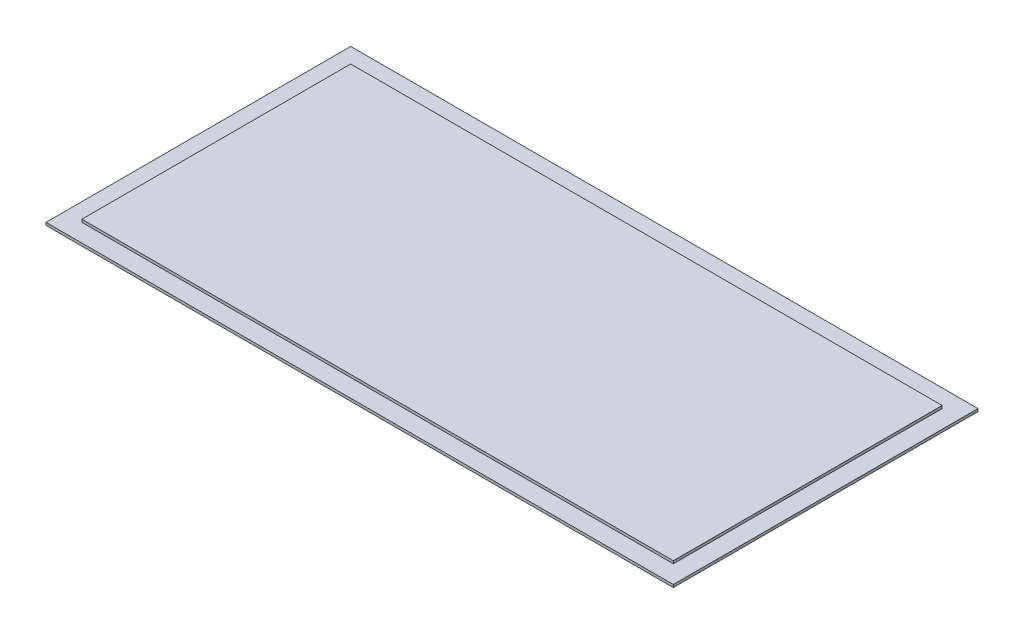
ISO-10303-21;
HEADER;
FILE_DESCRIPTION(('STEP AP214'),'2;1');
FILE_NAME('part.step','',(''),(''),'','','');
FILE_SCHEMA(('AUTOMOTIVE_DESIGN { 1 0 10303 214 1 1 1 1 }'));
ENDSEC;
DATA;
#1=APPLICATION_CONTEXT('core data for automotive mechanical design processes');
#2=APPLICATION_PROTOCOL_DEFINITION('international standard','automotive_design',2000,#1);
#3=PRODUCT_CONTEXT('',#1,'mechanical');
#4=PRODUCT('Part','Part','',(#3));
#5=PRODUCT_RELATED_PRODUCT_CATEGORY('part','',(#4));
#6=PRODUCT_DEFINITION_FORMATION('','',#4);
#7=PRODUCT_DEFINITION_CONTEXT('part definition',#1,'design');
#8=PRODUCT_DEFINITION('design','',#6,#7);
#9=PRODUCT_DEFINITION_SHAPE('','',#8);
#10=(LENGTH_UNIT() NAMED_UNIT(*) SI_UNIT(.MILLI.,.METRE.));
#11=(NAMED_UNIT(*) PLANE_ANGLE_UNIT() SI_UNIT($,.RADIAN.));
#12=(NAMED_UNIT(*) SI_UNIT($,.STERADIAN.) SOLID_ANGLE_UNIT());
#13=UNCERTAINTY_MEASURE_WITH_UNIT(LENGTH_MEASURE(1.E-05),#10,'distance_accuracy_value','');
#14=(GEOMETRIC_REPRESENTATION_CONTEXT(3) GLOBAL_UNCERTAINTY_ASSIGNED_CONTEXT((#13)) GLOBAL_UNIT_ASSIGNED_CONTEXT((#10,
#11,#12)) REPRESENTATION_CONTEXT('',''));
#15=CARTESIAN_POINT('',(0.,0.,0.));
#16=DIRECTION('',(0.,0.,1.));
#17=DIRECTION('',(1.,0.,0.));
#18=AXIS2_PLACEMENT_3D('',#15,#16,#17);
#19=CARTESIAN_POINT('',(0.,3.,0.));
#20=DIRECTION('',(0.,-1.,0.));
#21=DIRECTION('',(0.,0.,-1.));
#22=AXIS2_PLACEMENT_3D('',#19,#20,#21);
#23=PLANE('',#22);
#24=DIRECTION('',(0.,0.,1.));
#25=VECTOR('',#24,1.);
#26=CARTESIAN_POINT('',(-350.,3.,-170.));
#27=LINE('',#26,#25);
#28=CARTESIAN_POINT('',(-350.,3.,-170.));
#29=VERTEX_POINT('',#28);
#30=CARTESIAN_POINT('',(-350.,3.,170.));
#31=VERTEX_POINT('',#30);
#32=EDGE_CURVE('E132',#29,#31,#27,.T.);
#33=ORIENTED_EDGE('',*,*,#32,.T.);
#34=DIRECTION('',(1.,0.,0.));
#35=VECTOR('',#34,1.);
#36=CARTESIAN_POINT('',(350.,3.,170.));
#37=LINE('',#36,#35);
#38=CARTESIAN_POINT('',(350.,3.,170.));
#39=VERTEX_POINT('',#38);
#40=EDGE_CURVE('E135',#31,#39,#37,.T.);
#41=ORIENTED_EDGE('',*,*,#40,.T.);
#42=DIRECTION('',(0.,0.,-1.));
#43=VECTOR('',#42,1.);
#44=CARTESIAN_POINT('',(350.,3.,-170.));
#45=LINE('',#44,#43);
#46=CARTESIAN_POINT('',(350.,3.,-170.));
#47=VERTEX_POINT('',#46);
#48=EDGE_CURVE('E138',#39,#47,#45,.T.);
#49=ORIENTED_EDGE('',*,*,#48,.T.);
#50=DIRECTION('',(-1.,0.,0.));
#51=VECTOR('',#50,1.);
#52=CARTESIAN_POINT('',(350.,3.,-170.));
#53=LINE('',#52,#51);
#54=EDGE_CURVE('E140',#47,#29,#53,.T.);
#55=ORIENTED_EDGE('',*,*,#54,.T.);
#56=EDGE_LOOP('',(#33,#41,#49,#55));
#57=FACE_BOUND('',#56,.T.);
#58=DIRECTION('',(0.,0.,1.));
#59=VECTOR('',#58,1.);
#60=CARTESIAN_POINT('',(-330.,3.,-150.));
#61=LINE('',#60,#59);
#62=CARTESIAN_POINT('',(-330.,3.,-150.));
#63=VERTEX_POINT('',#62);
#64=CARTESIAN_POINT('',(-330.,3.,150.));
#65=VERTEX_POINT('',#64);
#66=EDGE_CURVE('E122',#63,#65,#61,.T.);
#67=ORIENTED_EDGE('',*,*,#66,.F.);
#68=DIRECTION('',(-1.,0.,0.));
#69=VECTOR('',#68,1.);
#70=CARTESIAN_POINT('',(330.,3.,-150.));
#71=LINE('',#70,#69);
#72=CARTESIAN_POINT('',(330.,3.,-150.));
#73=VERTEX_POINT('',#72);
#74=EDGE_CURVE('E119',#73,#63,#71,.T.);
#75=ORIENTED_EDGE('',*,*,#74,.F.);
#76=DIRECTION('',(0.,0.,-1.));
#77=VECTOR('',#76,1.);
#78=CARTESIAN_POINT('',(330.,3.,-150.));
#79=LINE('',#78,#77);
#80=CARTESIAN_POINT('',(330.,3.,150.));
#81=VERTEX_POINT('',#80);
#82=EDGE_CURVE('E57',#81,#73,#79,.T.);
#83=ORIENTED_EDGE('',*,*,#82,.F.);
#84=DIRECTION('',(1.,0.,0.));
#85=VECTOR('',#84,1.);
#86=CARTESIAN_POINT('',(330.,3.,150.));
#87=LINE('',#86,#85);
#88=EDGE_CURVE('E52',#65,#81,#87,.T.);
#89=ORIENTED_EDGE('',*,*,#88,.F.);
#90=EDGE_LOOP('',(#67,#75,#83,#89));
#91=FACE_BOUND('',#90,.T.);
#92=ADVANCED_FACE('F37',(#57,#91),#23,.F.);
#93=CARTESIAN_POINT('',(-350.,3.,-170.));
#94=DIRECTION('',(1.,0.,0.));
#95=DIRECTION('',(0.,0.,-1.));
#96=AXIS2_PLACEMENT_3D('',#93,#94,#95);
#97=PLANE('',#96);
#98=DIRECTION('',(0.,0.,1.));
#99=VECTOR('',#98,1.);
#100=CARTESIAN_POINT('',(-350.,0.,-170.));
#101=LINE('',#100,#99);
#102=CARTESIAN_POINT('',(-350.,0.,-170.));
#103=VERTEX_POINT('',#102);
#104=CARTESIAN_POINT('',(-350.,0.,170.));
#105=VERTEX_POINT('',#104);
#106=EDGE_CURVE('E123',#103,#105,#101,.T.);
#107=ORIENTED_EDGE('',*,*,#106,.T.);
#108=DIRECTION('',(0.,-1.,0.));
#109=VECTOR('',#108,1.);
#110=CARTESIAN_POINT('',(-350.,3.,170.));
#111=LINE('',#110,#109);
#112=EDGE_CURVE('E11',#31,#105,#111,.T.);
#113=ORIENTED_EDGE('',*,*,#112,.F.);
#114=ORIENTED_EDGE('',*,*,#32,.F.);
#115=DIRECTION('',(0.,-1.,0.));
#116=VECTOR('',#115,1.);
#117=CARTESIAN_POINT('',(-350.,3.,-170.));
#118=LINE('',#117,#116);
#119=EDGE_CURVE('E141',#29,#103,#118,.T.);
#120=ORIENTED_EDGE('',*,*,#119,.T.);
#121=EDGE_LOOP('',(#107,#113,#114,#120));
#122=FACE_BOUND('',#121,.T.);
#123=ADVANCED_FACE('F39',(#122),#97,.F.);
#124=CARTESIAN_POINT('',(350.,3.,170.));
#125=DIRECTION('',(0.,0.,-1.));
#126=DIRECTION('',(-1.,0.,0.));
#127=AXIS2_PLACEMENT_3D('',#124,#125,#126);
#128=PLANE('',#127);
#129=DIRECTION('',(1.,0.,0.));
#130=VECTOR('',#129,1.);
#131=CARTESIAN_POINT('',(350.,0.,170.));
#132=LINE('',#131,#130);
#133=CARTESIAN_POINT('',(350.,0.,170.));
#134=VERTEX_POINT('',#133);
#135=EDGE_CURVE('E126',#105,#134,#132,.T.);
#136=ORIENTED_EDGE('',*,*,#135,.T.);
#137=DIRECTION('',(0.,-1.,0.));
#138=VECTOR('',#137,1.);
#139=CARTESIAN_POINT('',(350.,3.,170.));
#140=LINE('',#139,#138);
#141=EDGE_CURVE('E45',#39,#134,#140,.T.);
#142=ORIENTED_EDGE('',*,*,#141,.F.);
#143=ORIENTED_EDGE('',*,*,#40,.F.);
#144=ORIENTED_EDGE('',*,*,#112,.T.);
#145=EDGE_LOOP('',(#136,#142,#143,#144));
#146=FACE_BOUND('',#145,.T.);
#147=ADVANCED_FACE('F171',(#146),#128,.F.);
#148=CARTESIAN_POINT('',(350.,3.,-170.));
#149=DIRECTION('',(-1.,0.,0.));
#150=DIRECTION('',(0.,0.,1.));
#151=AXIS2_PLACEMENT_3D('',#148,#149,#150);
#152=PLANE('',#151);
#153=DIRECTION('',(0.,0.,-1.));
#154=VECTOR('',#153,1.);
#155=CARTESIAN_POINT('',(350.,0.,-170.));
#156=LINE('',#155,#154);
#157=CARTESIAN_POINT('',(350.,0.,-170.));
#158=VERTEX_POINT('',#157);
#159=EDGE_CURVE('E144',#134,#158,#156,.T.);
#160=ORIENTED_EDGE('',*,*,#159,.T.);
#161=DIRECTION('',(0.,-1.,0.));
#162=VECTOR('',#161,1.);
#163=CARTESIAN_POINT('',(350.,3.,-170.));
#164=LINE('',#163,#162);
#165=EDGE_CURVE('E149',#47,#158,#164,.T.);
#166=ORIENTED_EDGE('',*,*,#165,.F.);
#167=ORIENTED_EDGE('',*,*,#48,.F.);
#168=ORIENTED_EDGE('',*,*,#141,.T.);
#169=EDGE_LOOP('',(#160,#166,#167,#168));
#170=FACE_BOUND('',#169,.T.);
#171=ADVANCED_FACE('F156',(#170),#152,.F.);
#172=CARTESIAN_POINT('',(350.,3.,-170.));
#173=DIRECTION('',(0.,0.,1.));
#174=DIRECTION('',(1.,0.,0.));
#175=AXIS2_PLACEMENT_3D('',#172,#173,#174);
#176=PLANE('',#175);
#177=DIRECTION('',(-1.,0.,0.));
#178=VECTOR('',#177,1.);
#179=CARTESIAN_POINT('',(350.,0.,-170.));
#180=LINE('',#179,#178);
#181=EDGE_CURVE('E136',#158,#103,#180,.T.);
#182=ORIENTED_EDGE('',*,*,#181,.T.);
#183=ORIENTED_EDGE('',*,*,#119,.F.);
#184=ORIENTED_EDGE('',*,*,#54,.F.);
#185=ORIENTED_EDGE('',*,*,#165,.T.);
#186=EDGE_LOOP('',(#182,#183,#184,#185));
#187=FACE_BOUND('',#186,.T.);
#188=ADVANCED_FACE('F165',(#187),#176,.F.);
#189=CARTESIAN_POINT('',(0.,0.,0.));
#190=DIRECTION('',(0.,-1.,0.));
#191=DIRECTION('',(0.,0.,-1.));
#192=AXIS2_PLACEMENT_3D('',#189,#190,#191);
#193=PLANE('',#192);
#194=ORIENTED_EDGE('',*,*,#106,.F.);
#195=ORIENTED_EDGE('',*,*,#181,.F.);
#196=ORIENTED_EDGE('',*,*,#159,.F.);
#197=ORIENTED_EDGE('',*,*,#135,.F.);
#198=EDGE_LOOP('',(#194,#195,#196,#197));
#199=FACE_BOUND('',#198,.T.);
#200=ADVANCED_FACE('F162',(#199),#193,.T.);
#201=CARTESIAN_POINT('',(-330.,6.,-150.));
#202=DIRECTION('',(1.,0.,0.));
#203=DIRECTION('',(0.,0.,-1.));
#204=AXIS2_PLACEMENT_3D('',#201,#202,#203);
#205=PLANE('',#204);
#206=ORIENTED_EDGE('',*,*,#66,.T.);
#207=DIRECTION('',(0.,-1.,0.));
#208=VECTOR('',#207,1.);
#209=CARTESIAN_POINT('',(-330.,6.,150.));
#210=LINE('',#209,#208);
#211=CARTESIAN_POINT('',(-330.,6.,150.));
#212=VERTEX_POINT('',#211);
#213=EDGE_CURVE('E103',#212,#65,#210,.T.);
#214=ORIENTED_EDGE('',*,*,#213,.F.);
#215=DIRECTION('',(0.,0.,1.));
#216=VECTOR('',#215,1.);
#217=CARTESIAN_POINT('',(-330.,6.,-150.));
#218=LINE('',#217,#216);
#219=CARTESIAN_POINT('',(-330.,6.,-150.));
#220=VERTEX_POINT('',#219);
#221=EDGE_CURVE('E110',#220,#212,#218,.T.);
#222=ORIENTED_EDGE('',*,*,#221,.F.);
#223=DIRECTION('',(0.,-1.,0.));
#224=VECTOR('',#223,1.);
#225=CARTESIAN_POINT('',(-330.,6.,-150.));
#226=LINE('',#225,#224);
#227=EDGE_CURVE('E266',#220,#63,#226,.T.);
#228=ORIENTED_EDGE('',*,*,#227,.T.);
#229=EDGE_LOOP('',(#206,#214,#222,#228));
#230=FACE_BOUND('',#229,.T.);
#231=ADVANCED_FACE('F121',(#230),#205,.F.);
#232=CARTESIAN_POINT('',(330.,6.,150.));
#233=DIRECTION('',(0.,0.,-1.));
#234=DIRECTION('',(-1.,0.,0.));
#235=AXIS2_PLACEMENT_3D('',#232,#233,#234);
#236=PLANE('',#235);
#237=ORIENTED_EDGE('',*,*,#88,.T.);
#238=DIRECTION('',(0.,-1.,0.));
#239=VECTOR('',#238,1.);
#240=CARTESIAN_POINT('',(330.,6.,150.));
#241=LINE('',#240,#239);
#242=CARTESIAN_POINT('',(330.,6.,150.));
#243=VERTEX_POINT('',#242);
#244=EDGE_CURVE('E106',#243,#81,#241,.T.);
#245=ORIENTED_EDGE('',*,*,#244,.F.);
#246=DIRECTION('',(1.,0.,0.));
#247=VECTOR('',#246,1.);
#248=CARTESIAN_POINT('',(330.,6.,150.));
#249=LINE('',#248,#247);
#250=EDGE_CURVE('E99',#212,#243,#249,.T.);
#251=ORIENTED_EDGE('',*,*,#250,.F.);
#252=ORIENTED_EDGE('',*,*,#213,.T.);
#253=EDGE_LOOP('',(#237,#245,#251,#252));
#254=FACE_BOUND('',#253,.T.);
#255=ADVANCED_FACE('F101',(#254),#236,.F.);
#256=CARTESIAN_POINT('',(330.,6.,-150.));
#257=DIRECTION('',(-1.,0.,0.));
#258=DIRECTION('',(0.,0.,1.));
#259=AXIS2_PLACEMENT_3D('',#256,#257,#258);
#260=PLANE('',#259);
#261=ORIENTED_EDGE('',*,*,#82,.T.);
#262=DIRECTION('',(0.,-1.,0.));
#263=VECTOR('',#262,1.);
#264=CARTESIAN_POINT('',(330.,6.,-150.));
#265=LINE('',#264,#263);
#266=CARTESIAN_POINT('',(330.,6.,-150.));
#267=VERTEX_POINT('',#266);
#268=EDGE_CURVE('E128',#267,#73,#265,.T.);
#269=ORIENTED_EDGE('',*,*,#268,.F.);
#270=DIRECTION('',(0.,0.,-1.));
#271=VECTOR('',#270,1.);
#272=CARTESIAN_POINT('',(330.,6.,-150.));
#273=LINE('',#272,#271);
#274=EDGE_CURVE('E109',#243,#267,#273,.T.);
#275=ORIENTED_EDGE('',*,*,#274,.F.);
#276=ORIENTED_EDGE('',*,*,#244,.T.);
#277=EDGE_LOOP('',(#261,#269,#275,#276));
#278=FACE_BOUND('',#277,.T.);
#279=ADVANCED_FACE('F208',(#278),#260,.F.);
#280=CARTESIAN_POINT('',(330.,6.,-150.));
#281=DIRECTION('',(0.,0.,1.));
#282=DIRECTION('',(1.,0.,0.));
#283=AXIS2_PLACEMENT_3D('',#280,#281,#282);
#284=PLANE('',#283);
#285=ORIENTED_EDGE('',*,*,#74,.T.);
#286=ORIENTED_EDGE('',*,*,#227,.F.);
#287=DIRECTION('',(-1.,0.,0.));
#288=VECTOR('',#287,1.);
#289=CARTESIAN_POINT('',(330.,6.,-150.));
#290=LINE('',#289,#288);
#291=EDGE_CURVE('E115',#267,#220,#290,.T.);
#292=ORIENTED_EDGE('',*,*,#291,.F.);
#293=ORIENTED_EDGE('',*,*,#268,.T.);
#294=EDGE_LOOP('',(#285,#286,#292,#293));
#295=FACE_BOUND('',#294,.T.);
#296=ADVANCED_FACE('F214',(#295),#284,.F.);
#297=CARTESIAN_POINT('',(0.,6.,0.));
#298=DIRECTION('',(0.,-1.,0.));
#299=DIRECTION('',(0.,0.,-1.));
#300=AXIS2_PLACEMENT_3D('',#297,#298,#299);
#301=PLANE('',#300);
#302=ORIENTED_EDGE('',*,*,#221,.T.);
#303=ORIENTED_EDGE('',*,*,#250,.T.);
#304=ORIENTED_EDGE('',*,*,#274,.T.);
#305=ORIENTED_EDGE('',*,*,#291,.T.);
#306=EDGE_LOOP('',(#302,#303,#304,#305));
#307=FACE_BOUND('',#306,.T.);
#308=ADVANCED_FACE('F113',(#307),#301,.F.);
#309=CLOSED_SHELL('',(#92,#123,#147,#171,#188,#200,#231,#255,#279,#296,#308));
#310=MANIFOLD_SOLID_BREP('B2',#309);
#311=ADVANCED_BREP_SHAPE_REPRESENTATION('',(#18,#310),#14);
#312=SHAPE_DEFINITION_REPRESENTATION(#9,#311);
ENDSEC;
END-ISO-10303-21;
